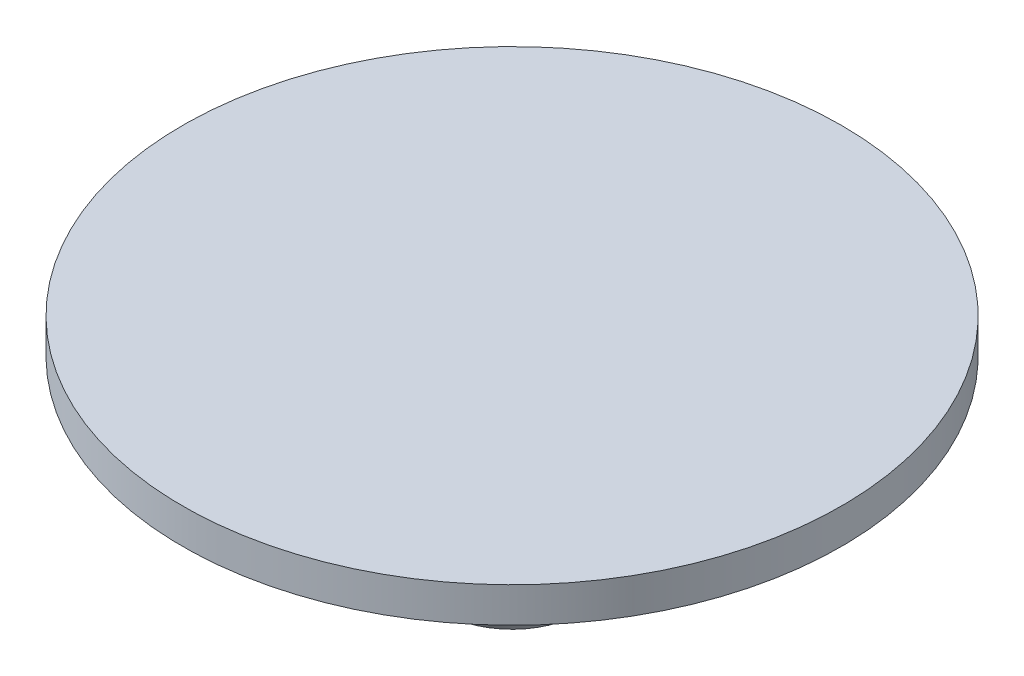
ISO-10303-21;
HEADER;
FILE_DESCRIPTION(('STEP AP214'),'2;1');
FILE_NAME('part.step','',(''),(''),'','','');
FILE_SCHEMA(('AUTOMOTIVE_DESIGN { 1 0 10303 214 1 1 1 1 }'));
ENDSEC;
DATA;
#1=APPLICATION_CONTEXT('core data for automotive mechanical design processes');
#2=APPLICATION_PROTOCOL_DEFINITION('international standard','automotive_design',2000,#1);
#3=PRODUCT_CONTEXT('',#1,'mechanical');
#4=PRODUCT('Part','Part','',(#3));
#5=PRODUCT_RELATED_PRODUCT_CATEGORY('part','',(#4));
#6=PRODUCT_DEFINITION_FORMATION('','',#4);
#7=PRODUCT_DEFINITION_CONTEXT('part definition',#1,'design');
#8=PRODUCT_DEFINITION('design','',#6,#7);
#9=PRODUCT_DEFINITION_SHAPE('','',#8);
#10=(LENGTH_UNIT() NAMED_UNIT(*) SI_UNIT(.MILLI.,.METRE.));
#11=(NAMED_UNIT(*) PLANE_ANGLE_UNIT() SI_UNIT($,.RADIAN.));
#12=(NAMED_UNIT(*) SI_UNIT($,.STERADIAN.) SOLID_ANGLE_UNIT());
#13=UNCERTAINTY_MEASURE_WITH_UNIT(LENGTH_MEASURE(1.E-05),#10,'distance_accuracy_value','');
#14=(GEOMETRIC_REPRESENTATION_CONTEXT(3) GLOBAL_UNCERTAINTY_ASSIGNED_CONTEXT((#13)) GLOBAL_UNIT_ASSIGNED_CONTEXT((#10,
#11,#12)) REPRESENTATION_CONTEXT('',''));
#15=CARTESIAN_POINT('',(0.,0.,0.));
#16=DIRECTION('',(0.,0.,1.));
#17=DIRECTION('',(1.,0.,0.));
#18=AXIS2_PLACEMENT_3D('',#15,#16,#17);
#19=CARTESIAN_POINT('',(0.,0.,0.));
#20=DIRECTION('',(0.,1.,0.));
#21=DIRECTION('',(0.,0.,1.));
#22=AXIS2_PLACEMENT_3D('',#19,#20,#21);
#23=PLANE('',#22);
#24=CARTESIAN_POINT('',(0.,0.,0.));
#25=DIRECTION('',(0.,-1.,0.));
#26=DIRECTION('',(0.,0.,-1.));
#27=AXIS2_PLACEMENT_3D('',#24,#25,#26);
#28=CIRCLE('',#27,14.1);
#29=CARTESIAN_POINT('',(0.,0.,-14.1));
#30=VERTEX_POINT('',#29);
#31=EDGE_CURVE('E10',#30,#30,#28,.T.);
#32=ORIENTED_EDGE('',*,*,#31,.F.);
#33=EDGE_LOOP('',(#32));
#34=FACE_BOUND('',#33,.T.);
#35=ADVANCED_FACE('F32',(#34),#23,.T.);
#36=CARTESIAN_POINT('',(0.,-1.5,0.));
#37=DIRECTION('',(0.,-1.,0.));
#38=DIRECTION('',(0.,0.,-1.));
#39=AXIS2_PLACEMENT_3D('',#36,#37,#38);
#40=CYLINDRICAL_SURFACE('',#39,14.1);
#41=ORIENTED_EDGE('',*,*,#31,.T.);
#42=EDGE_LOOP('',(#41));
#43=FACE_BOUND('',#42,.T.);
#44=CARTESIAN_POINT('',(0.,-1.5,0.));
#45=DIRECTION('',(0.,-1.,0.));
#46=DIRECTION('',(0.,0.,-1.));
#47=AXIS2_PLACEMENT_3D('',#44,#45,#46);
#48=CIRCLE('',#47,14.1);
#49=CARTESIAN_POINT('',(0.,-1.5,-14.1));
#50=VERTEX_POINT('',#49);
#51=EDGE_CURVE('E44',#50,#50,#48,.T.);
#52=ORIENTED_EDGE('',*,*,#51,.F.);
#53=EDGE_LOOP('',(#52));
#54=FACE_BOUND('',#53,.T.);
#55=ADVANCED_FACE('F95',(#43,#54),#40,.T.);
#56=CARTESIAN_POINT('',(14.1,-1.5,0.));
#57=DIRECTION('',(0.,-1.,0.));
#58=DIRECTION('',(0.,0.,-1.));
#59=AXIS2_PLACEMENT_3D('',#56,#57,#58);
#60=PLANE('',#59);
#61=ORIENTED_EDGE('',*,*,#51,.T.);
#62=EDGE_LOOP('',(#61));
#63=FACE_BOUND('',#62,.T.);
#64=CARTESIAN_POINT('',(0.,-1.5,0.));
#65=DIRECTION('',(0.,-1.,0.));
#66=DIRECTION('',(0.,0.,-1.));
#67=AXIS2_PLACEMENT_3D('',#64,#65,#66);
#68=CIRCLE('',#67,6.85);
#69=CARTESIAN_POINT('',(0.,-1.5,-6.85));
#70=VERTEX_POINT('',#69);
#71=EDGE_CURVE('E48',#70,#70,#68,.T.);
#72=ORIENTED_EDGE('',*,*,#71,.F.);
#73=EDGE_LOOP('',(#72));
#74=FACE_BOUND('',#73,.T.);
#75=ADVANCED_FACE('F91',(#63,#74),#60,.T.);
#76=CARTESIAN_POINT('',(0.,-9.5,0.));
#77=DIRECTION('',(0.,1.,0.));
#78=DIRECTION('',(0.,0.,1.));
#79=AXIS2_PLACEMENT_3D('',#76,#77,#78);
#80=CONICAL_SURFACE('',#79,3.,0.448535409414174);
#81=CARTESIAN_POINT('',(-0.633272972255013,-4.52228697401176,-5.35823186437053));
#82=CARTESIAN_POINT('',(-0.582962055692206,-4.49272093928371,-5.37850607182665));
#83=CARTESIAN_POINT('',(-0.529990890777475,-4.4663413441588,-5.39678092828851));
#84=CARTESIAN_POINT('',(-0.419568643337227,-4.42101153491379,-5.42836359473395));
#85=CARTESIAN_POINT('',(-0.362121337565608,-4.40205513712441,-5.44167553847619));
#86=CARTESIAN_POINT('',(-0.243768429368954,-4.3724763172608,-5.46251107954339));
#87=CARTESIAN_POINT('',(-0.18284697818391,-4.36189601964438,-5.47000541576709));
#88=CARTESIAN_POINT('',(-0.0596564082112393,-4.34989335628605,-5.47851062070043));
#89=CARTESIAN_POINT('',(0.00261238422585923,-4.34846879723026,-5.47952304219267));
#90=CARTESIAN_POINT('',(0.122528147838459,-4.35466228519997,-5.47513102623614));
#91=CARTESIAN_POINT('',(0.180220297473829,-4.36171948178841,-5.47012457629421));
#92=CARTESIAN_POINT('',(0.293365693468892,-4.38354706839695,-5.45470585520708));
#93=CARTESIAN_POINT('',(0.348818667041851,-4.39831839515207,-5.44429292754844));
#94=CARTESIAN_POINT('',(0.457103744456638,-4.4351461457224,-5.41849719708117));
#95=CARTESIAN_POINT('',(0.509875094985693,-4.45732240695604,-5.40303273901462));
#96=CARTESIAN_POINT('',(0.610837214912478,-4.50795078170534,-5.36803231896509));
#97=CARTESIAN_POINT('',(0.659026298046859,-4.5364051928733,-5.3484948665086));
#98=CARTESIAN_POINT('',(0.756261611645401,-4.60276655659272,-5.30341941110671));
#99=CARTESIAN_POINT('',(0.804583605372491,-4.64142508293112,-5.27742991787235));
#100=CARTESIAN_POINT('',(0.89416797875589,-4.72438761426675,-5.22249235860638));
#101=CARTESIAN_POINT('',(0.935426096925696,-4.76869499918064,-5.19354252336458));
#102=CARTESIAN_POINT('',(1.01726098527355,-4.87017588870365,-5.12842464391135));
#103=CARTESIAN_POINT('',(1.0564374839851,-4.92824094328228,-5.09188340347651));
#104=CARTESIAN_POINT('',(1.12438273064406,-5.04945663946227,-5.01754963505027));
#105=CARTESIAN_POINT('',(1.15314397639543,-5.11261090699562,-4.97975622641435));
#106=CARTESIAN_POINT('',(1.20293967786085,-5.25135627713908,-4.89926539707666));
#107=CARTESIAN_POINT('',(1.22247417309756,-5.32749437401264,-4.85657222151437));
#108=CARTESIAN_POINT('',(1.24700956332617,-5.48308287996698,-4.77298156918373));
#109=CARTESIAN_POINT('',(1.25200652285652,-5.56253418006292,-4.73208458161259));
#110=CARTESIAN_POINT('',(1.24653941806823,-5.72271943434377,-4.653768121928));
#111=CARTESIAN_POINT('',(1.23606932120088,-5.80345387683626,-4.61635001271746));
#112=CARTESIAN_POINT('',(1.19882761930746,-5.96335908775868,-4.54662401054345));
#113=CARTESIAN_POINT('',(1.17207343468682,-6.04253143397295,-4.51431070302596));
#114=CARTESIAN_POINT('',(1.10608956779471,-6.18706269625163,-4.45927966951933));
#115=CARTESIAN_POINT('',(1.06862198356642,-6.25296918752537,-4.43588893360888));
#116=CARTESIAN_POINT('',(0.981374987852063,-6.37794395911093,-4.39439805536346));
#117=CARTESIAN_POINT('',(0.931603757932647,-6.4370167454726,-4.37629441464452));
#118=CARTESIAN_POINT('',(0.826966453509696,-6.53991707801657,-4.34681022023684));
#119=CARTESIAN_POINT('',(0.773167785729984,-6.58469104785266,-4.33492642440838));
#120=CARTESIAN_POINT('',(0.658381129818306,-6.66486200186304,-4.31481437924573));
#121=CARTESIAN_POINT('',(0.597394333814064,-6.7002605377694,-4.30658552482778));
#122=CARTESIAN_POINT('',(0.472004188387053,-6.75947200632147,-4.29343448064075));
#123=CARTESIAN_POINT('',(0.40776079441884,-6.78360407062297,-4.28841947917799));
#124=CARTESIAN_POINT('',(0.276058545860753,-6.82105621928804,-4.28084698650507));
#125=CARTESIAN_POINT('',(0.208599716360258,-6.83437638799999,-4.2782894761229));
#126=CARTESIAN_POINT('',(0.0720940392704948,-6.84981585361144,-4.2753386616857));
#127=CARTESIAN_POINT('',(0.00304193657907059,-6.85189032383684,-4.27495401867934));
#128=CARTESIAN_POINT('',(-0.134444039661222,-6.84465398526422,-4.276324505544));
#129=CARTESIAN_POINT('',(-0.202877893707582,-6.8353428185635,-4.27807970267999));
#130=CARTESIAN_POINT('',(-0.337386850640317,-6.80558201500571,-4.28394677750608));
#131=CARTESIAN_POINT('',(-0.403454498884584,-6.78509999913953,-4.28806550778029));
#132=CARTESIAN_POINT('',(-0.53111862978522,-6.7336438563374,-4.29908208430313));
#133=CARTESIAN_POINT('',(-0.592715443922478,-6.7026705082268,-4.30597972426625));
#134=CARTESIAN_POINT('',(-0.7094038382995,-6.63145354549162,-4.32303105994163));
#135=CARTESIAN_POINT('',(-0.764523815875468,-6.59125287029697,-4.3331697566333));
#136=CARTESIAN_POINT('',(-0.867057524664055,-6.50293358552318,-4.35716749814495));
#137=CARTESIAN_POINT('',(-0.914472143009496,-6.4548158887315,-4.37102611419559));
#138=CARTESIAN_POINT('',(-1.00040316532292,-6.35243410903065,-4.40270394020078));
#139=CARTESIAN_POINT('',(-1.03892729108261,-6.29817542137013,-4.42051968661147));
#140=CARTESIAN_POINT('',(-1.10643568614045,-6.1853422832638,-4.46007472684007));
#141=CARTESIAN_POINT('',(-1.13541850305561,-6.12676717742984,-4.48181461721413));
#142=CARTESIAN_POINT('',(-1.18453088449555,-6.00481269523303,-4.52977850338575));
#143=CARTESIAN_POINT('',(-1.20427795132247,-5.94133521304163,-4.55614258020141));
#144=CARTESIAN_POINT('',(-1.23339006945145,-5.81343917855876,-4.61208960740105));
#145=CARTESIAN_POINT('',(-1.24275094677872,-5.74902025845387,-4.64167384665468));
#146=CARTESIAN_POINT('',(-1.25191535159751,-5.61432188361672,-4.70632087074806));
#147=CARTESIAN_POINT('',(-1.2506806782118,-5.54409377336257,-4.7416360672416));
#148=CARTESIAN_POINT('',(-1.23677045533377,-5.4057325595818,-4.81406106105282));
#149=CARTESIAN_POINT('',(-1.2240894874623,-5.33760046405091,-4.85117170041196));
#150=CARTESIAN_POINT('',(-1.18573215147421,-5.19694995765824,-4.93035156065004));
#151=CARTESIAN_POINT('',(-1.1587223610357,-5.1248356566689,-4.97249784947305));
#152=CARTESIAN_POINT('',(-1.0916695234403,-4.986249114745,-5.05589748642324));
#153=CARTESIAN_POINT('',(-1.05161251034163,-4.9197830162877,-5.09714982696444));
#154=CARTESIAN_POINT('',(-0.956617590956275,-4.79124871222183,-5.1787703611877));
#155=CARTESIAN_POINT('',(-0.901051085727982,-4.72955123505996,-5.21899814868899));
#156=CARTESIAN_POINT('',(-0.7766769183392,-4.61701171447418,-5.29368516333928));
#157=CARTESIAN_POINT('',(-0.707901652317313,-4.5661437410352,-5.32815812600261));
#158=CARTESIAN_POINT('',(-0.633272972255013,-4.52228697401176,-5.35823186437053));
#159=B_SPLINE_CURVE_WITH_KNOTS('',3,(#81,#82,#83,#84,#85,#86,#87,#88,#89,#90,#91,#92,#93,#94,
#95,#96,#97,#98,#99,#100,#101,#102,#103,#104,#105,#106,#107,#108,#109,#110,#111,#112,#113,#114,
#115,#116,#117,#118,#119,#120,#121,#122,#123,#124,#125,#126,#127,#128,#129,#130,#131,#132,#133,
#134,#135,#136,#137,#138,#139,#140,#141,#142,#143,#144,#145,#146,#147,#148,#149,#150,#151,#152,
#153,#154,#155,#156,#157,#158),.UNSPECIFIED.,.T.,.F.,(4,2,2,2,2,2,2,2,2,2,2,2,2,2,2,2,2,2,2,2,2,
2,2,2,2,2,2,2,2,2,2,2,2,2,2,2,2,2,4),(0.,0.185100254813369,0.370045987790329,0.555916029987707,
0.741741544205221,0.915926712712724,1.09013303762993,1.26730754010537,1.44454699207137,
1.64514816923708,1.84586994165695,2.08194966146773,2.31819909485878,2.58530703768191,
2.85248728266774,3.11977176231852,3.38677080748728,3.62344423209498,3.85996069712196,
4.07189143638563,4.28378707695089,4.48924910284956,4.69470952583281,4.90098833923221,
5.10727363708584,5.31416006094039,5.52103112992022,5.72695836945884,5.93286188337595,
6.13858588207995,6.34434118173401,6.55799369435035,6.77173203801726,7.00663567148817,
7.24165056060052,7.50384751993755,7.7663260662643,8.04156108416425,8.3161294808396),.UNSPECIFIED.);
#160=CARTESIAN_POINT('',(-0.633272972255013,-4.52228697401176,-5.35823186437053));
#161=VERTEX_POINT('',#160);
#162=EDGE_CURVE('E62',#161,#161,#159,.T.);
#163=ORIENTED_EDGE('',*,*,#162,.F.);
#164=EDGE_LOOP('',(#163));
#165=FACE_BOUND('',#164,.T.);
#166=ORIENTED_EDGE('',*,*,#71,.T.);
#167=EDGE_LOOP('',(#166));
#168=FACE_BOUND('',#167,.T.);
#169=CARTESIAN_POINT('',(0.,-9.5,0.));
#170=DIRECTION('',(0.,-1.,0.));
#171=DIRECTION('',(0.,0.,-1.));
#172=AXIS2_PLACEMENT_3D('',#169,#170,#171);
#173=CIRCLE('',#172,3.);
#174=CARTESIAN_POINT('',(0.,-9.5,-3.));
#175=VERTEX_POINT('',#174);
#176=EDGE_CURVE('E53',#175,#175,#173,.T.);
#177=ORIENTED_EDGE('',*,*,#176,.F.);
#178=EDGE_LOOP('',(#177));
#179=FACE_BOUND('',#178,.T.);
#180=ADVANCED_FACE('F68',(#165,#168,#179),#80,.T.);
#181=CARTESIAN_POINT('',(3.,-9.5,0.));
#182=DIRECTION('',(0.,-1.,0.));
#183=DIRECTION('',(0.,0.,-1.));
#184=AXIS2_PLACEMENT_3D('',#181,#182,#183);
#185=PLANE('',#184);
#186=ORIENTED_EDGE('',*,*,#176,.T.);
#187=EDGE_LOOP('',(#186));
#188=FACE_BOUND('',#187,.T.);
#189=CARTESIAN_POINT('',(0.,-9.5,0.));
#190=DIRECTION('',(0.,-1.,0.));
#191=DIRECTION('',(0.,0.,-1.));
#192=AXIS2_PLACEMENT_3D('',#189,#190,#191);
#193=CIRCLE('',#192,2.);
#194=CARTESIAN_POINT('',(0.,-9.5,-2.));
#195=VERTEX_POINT('',#194);
#196=EDGE_CURVE('E56',#195,#195,#193,.T.);
#197=ORIENTED_EDGE('',*,*,#196,.F.);
#198=EDGE_LOOP('',(#197));
#199=FACE_BOUND('',#198,.T.);
#200=ADVANCED_FACE('F84',(#188,#199),#185,.T.);
#201=CARTESIAN_POINT('',(0.,-1.5,0.));
#202=DIRECTION('',(0.,-1.,0.));
#203=DIRECTION('',(0.,0.,-1.));
#204=AXIS2_PLACEMENT_3D('',#201,#202,#203);
#205=CYLINDRICAL_SURFACE('',#204,2.);
#206=CARTESIAN_POINT('',(0.,-4.35,-2.));
#207=CARTESIAN_POINT('',(-0.0635104730002026,-4.35000434999878,-1.99999595305313));
#208=CARTESIAN_POINT('',(-0.127096441053758,-4.35487301181781,-1.99694323311001));
#209=CARTESIAN_POINT('',(-0.252318262265282,-4.3740858034295,-1.98502167724102));
#210=CARTESIAN_POINT('',(-0.313950163299073,-4.38844799392548,-1.97614175574896));
#211=CARTESIAN_POINT('',(-0.433205558136783,-4.42581136316205,-1.95345852982134));
#212=CARTESIAN_POINT('',(-0.490847243665017,-4.44876978784088,-1.93967960778663));
#213=CARTESIAN_POINT('',(-0.60126036886836,-4.50238585079675,-1.90834598486073));
#214=CARTESIAN_POINT('',(-0.654032347276152,-4.53304263600919,-1.89079170235271));
#215=CARTESIAN_POINT('',(-0.757974192167973,-4.60388657318497,-1.85170152902273));
#216=CARTESIAN_POINT('',(-0.808679560769977,-4.64463929997545,-1.82995962224617));
#217=CARTESIAN_POINT('',(-0.90298637514676,-4.73321917450655,-1.78531349913632));
#218=CARTESIAN_POINT('',(-0.946578107215734,-4.78105582825794,-1.76240774858553));
#219=CARTESIAN_POINT('',(-1.03142873237132,-4.89003389420452,-1.71430418655199));
#220=CARTESIAN_POINT('',(-1.07157206029151,-4.95209978660728,-1.68921610993412));
#221=CARTESIAN_POINT('',(-1.14073966020039,-5.08356481544719,-1.64330198128731));
#222=CARTESIAN_POINT('',(-1.16978270899534,-5.15295131257608,-1.62246875996238));
#223=CARTESIAN_POINT('',(-1.20933400585981,-5.27881052377872,-1.59309575627364));
#224=CARTESIAN_POINT('',(-1.22269552371394,-5.33396681853882,-1.58276905990074));
#225=CARTESIAN_POINT('',(-1.2418184358548,-5.4463059256108,-1.56781357325805));
#226=CARTESIAN_POINT('',(-1.24759056342088,-5.50348575827449,-1.56317673673692));
#227=CARTESIAN_POINT('',(-1.2511891824572,-5.61841301675112,-1.56029885782827));
#228=CARTESIAN_POINT('',(-1.24899483727851,-5.6761615364624,-1.56207458771719));
#229=CARTESIAN_POINT('',(-1.23676317046804,-5.79031010318896,-1.5717740238392));
#230=CARTESIAN_POINT('',(-1.22671956265044,-5.84670903203908,-1.5797026576711));
#231=CARTESIAN_POINT('',(-1.19968103371474,-5.95543845265748,-1.60032573121781));
#232=CARTESIAN_POINT('',(-1.18285016736897,-6.00783245568427,-1.61290715104814));
#233=CARTESIAN_POINT('',(-1.14290189820938,-6.10916118240542,-1.64145566443406));
#234=CARTESIAN_POINT('',(-1.11978227193696,-6.15809467487449,-1.65742395501353));
#235=CARTESIAN_POINT('',(-1.06294892954949,-6.26083327383274,-1.6945481599302));
#236=CARTESIAN_POINT('',(-1.0280629660117,-6.31384081012039,-1.71611591575959));
#237=CARTESIAN_POINT('',(-0.950881463002103,-6.41383027900048,-1.76005711791243));
#238=CARTESIAN_POINT('',(-0.908578308011438,-6.46080593170652,-1.78243137335975));
#239=CARTESIAN_POINT('',(-0.809519713023333,-6.55530174937039,-1.82979894916857));
#240=CARTESIAN_POINT('',(-0.751531353595334,-6.60163297425883,-1.85461531676593));
#241=CARTESIAN_POINT('',(-0.627148099593571,-6.68385089588725,-1.90028055062445));
#242=CARTESIAN_POINT('',(-0.560756523882,-6.71974169772893,-1.92113097514764));
#243=CARTESIAN_POINT('',(-0.42488356293475,-6.77776368838142,-1.95553372961316));
#244=CARTESIAN_POINT('',(-0.355763457732372,-6.80053403998118,-1.96941976591574));
#245=CARTESIAN_POINT('',(-0.213612154574977,-6.83376492798281,-1.98984929310048));
#246=CARTESIAN_POINT('',(-0.140586648341306,-6.844242894222,-1.9964031799007));
#247=CARTESIAN_POINT('',(-0.00451561874058984,-6.8515658500612,-2.00097840540091));
#248=CARTESIAN_POINT('',(0.0584027741637836,-6.85020317795385,-2.00012161345511));
#249=CARTESIAN_POINT('',(0.182972117996308,-6.83811717157928,-1.99258901494327));
#250=CARTESIAN_POINT('',(0.244623154962732,-6.82739447490784,-1.98591360473591));
#251=CARTESIAN_POINT('',(0.362521070658188,-6.79776146330804,-1.9677405228307));
#252=CARTESIAN_POINT('',(0.418885009953203,-6.77918784320335,-1.95644170526844));
#253=CARTESIAN_POINT('',(0.527638281070987,-6.73470361072143,-1.92995684104751));
#254=CARTESIAN_POINT('',(0.580026945470714,-6.70879176974485,-1.91477014350266));
#255=CARTESIAN_POINT('',(0.685084056277256,-6.64748479400452,-1.87990012356));
#256=CARTESIAN_POINT('',(0.737246967843403,-6.61139643076176,-1.85991764817225));
#257=CARTESIAN_POINT('',(0.83514264021734,-6.53220613484719,-1.81806970001717));
#258=CARTESIAN_POINT('',(0.880868151291853,-6.48909641074546,-1.79620214826384));
#259=CARTESIAN_POINT('',(0.971474198022883,-6.38986496058735,-1.74905869713091));
#260=CARTESIAN_POINT('',(1.01526851939752,-6.33276279370522,-1.72374883414957));
#261=CARTESIAN_POINT('',(1.09280351885684,-6.21112421505575,-1.67566762748172));
#262=CARTESIAN_POINT('',(1.12655115718693,-6.14659299324701,-1.65289453322336));
#263=CARTESIAN_POINT('',(1.17684772011828,-6.02530785194313,-1.61733530314592));
#264=CARTESIAN_POINT('',(1.19551895865479,-5.96975924926778,-1.6034563619378));
#265=CARTESIAN_POINT('',(1.22500108205245,-5.85560685423108,-1.58105030663767));
#266=CARTESIAN_POINT('',(1.23582424983127,-5.79700799054854,-1.57251483242605));
#267=CARTESIAN_POINT('',(1.24901383653654,-5.67790972311931,-1.56206324988732));
#268=CARTESIAN_POINT('',(1.25133186963292,-5.61740141451183,-1.56018501674569));
#269=CARTESIAN_POINT('',(1.24719778716818,-5.49686903963396,-1.56349063109847));
#270=CARTESIAN_POINT('',(1.24074275650143,-5.43684514099049,-1.56867682595586));
#271=CARTESIAN_POINT('',(1.22038272403399,-5.32397020494864,-1.58455388771334));
#272=CARTESIAN_POINT('',(1.2071191949977,-5.27093069858359,-1.5947680805106));
#273=CARTESIAN_POINT('',(1.17417623469513,-5.16786494041409,-1.6191753043569));
#274=CARTESIAN_POINT('',(1.15449412799407,-5.1178399554625,-1.63336999423727));
#275=CARTESIAN_POINT('',(1.10602690439618,-5.0144032561273,-1.66663902886518));
#276=CARTESIAN_POINT('',(1.0763364445546,-4.96154970152345,-1.68612230498997));
#277=CARTESIAN_POINT('',(1.0100001703639,-4.861061632754,-1.72667706411868));
#278=CARTESIAN_POINT('',(0.973348732866944,-4.81343138743952,-1.74774982276825));
#279=CARTESIAN_POINT('',(0.885670221416064,-4.71498574502216,-1.79401910731181));
#280=CARTESIAN_POINT('',(0.833233674246798,-4.66540915455452,-1.81920541808776));
#281=CARTESIAN_POINT('',(0.719822446025208,-4.57550517029476,-1.86698729056748));
#282=CARTESIAN_POINT('',(0.658842515138554,-4.5351835040726,-1.88958124364395));
#283=CARTESIAN_POINT('',(0.529355399891412,-4.4652288698759,-1.92986710976548));
#284=CARTESIAN_POINT('',(0.460835727056574,-4.43561399459416,-1.94755071355356));
#285=CARTESIAN_POINT('',(0.318394712729503,-4.38892811566825,-1.97581521637842));
#286=CARTESIAN_POINT('',(0.244493501106853,-4.37181276513022,-1.98642121428689));
#287=CARTESIAN_POINT('',(0.141418481224667,-4.35770079083737,-1.99519472168143));
#288=CARTESIAN_POINT('',(0.113248608862872,-4.35481813466603,-1.99699172226301));
#289=CARTESIAN_POINT('',(0.0567241864870909,-4.3509667084624,-1.9993953021324));
#290=CARTESIAN_POINT('',(0.0283696251514533,-4.34999805689001,-2.00000180773911));
#291=CARTESIAN_POINT('',(0.,-4.35,-2.));
#292=B_SPLINE_CURVE_WITH_KNOTS('',3,(#206,#207,#208,#209,#210,#211,#212,#213,#214,#215,#216,
#217,#218,#219,#220,#221,#222,#223,#224,#225,#226,#227,#228,#229,#230,#231,#232,#233,#234,#235,
#236,#237,#238,#239,#240,#241,#242,#243,#244,#245,#246,#247,#248,#249,#250,#251,#252,#253,#254,
#255,#256,#257,#258,#259,#260,#261,#262,#263,#264,#265,#266,#267,#268,#269,#270,#271,#272,#273,
#274,#275,#276,#277,#278,#279,#280,#281,#282,#283,#284,#285,#286,#287,#288,#289,#290,#291),
.UNSPECIFIED.,.T.,.F.,(4,2,2,2,2,2,2,2,2,2,2,2,2,2,2,2,2,2,2,2,2,2,2,2,2,2,2,2,2,2,2,2,2,2,2,2,
2,2,2,2,2,2,4),(0.,0.190412301434133,0.381187894128462,0.571026987595136,0.760845054038796,
0.965821870536219,1.17107628325702,1.40412975852973,1.63678724607011,1.80912008879717,
1.98120894707391,2.15374823498778,2.32642584505083,2.49515839460437,2.66395067908033,
2.8642745035436,3.06480522575182,3.29842180699522,3.53194640727861,3.75284174135959,
3.97342347958131,4.16127180597573,4.34910733732281,4.52959504531298,4.71011298928466,
4.90885230990553,5.10781368827686,5.33565708863713,5.5633422719691,5.7432994031372,
5.92297427413352,6.10366974688201,6.28442527563864,6.45063169037741,6.61690747313442,
6.80725523036979,6.99775741153769,7.22600539035112,7.454394245785,7.68316725607078,
7.91112460944408,7.99617501232481,8.08123067890588),.UNSPECIFIED.);
#293=CARTESIAN_POINT('',(0.,-4.35,-2.));
#294=VERTEX_POINT('',#293);
#295=EDGE_CURVE('E35',#294,#294,#292,.T.);
#296=ORIENTED_EDGE('',*,*,#295,.F.);
#297=EDGE_LOOP('',(#296));
#298=FACE_BOUND('',#297,.T.);
#299=ORIENTED_EDGE('',*,*,#196,.T.);
#300=EDGE_LOOP('',(#299));
#301=FACE_BOUND('',#300,.T.);
#302=CARTESIAN_POINT('',(0.,-1.5,0.));
#303=DIRECTION('',(0.,-1.,0.));
#304=DIRECTION('',(0.,0.,-1.));
#305=AXIS2_PLACEMENT_3D('',#302,#303,#304);
#306=CIRCLE('',#305,2.);
#307=CARTESIAN_POINT('',(0.,-1.5,-2.));
#308=VERTEX_POINT('',#307);
#309=EDGE_CURVE('E59',#308,#308,#306,.T.);
#310=ORIENTED_EDGE('',*,*,#309,.F.);
#311=EDGE_LOOP('',(#310));
#312=FACE_BOUND('',#311,.T.);
#313=ADVANCED_FACE('F80',(#298,#301,#312),#205,.F.);
#314=CARTESIAN_POINT('',(2.,-1.5,0.));
#315=DIRECTION('',(0.,-1.,0.));
#316=DIRECTION('',(0.,0.,-1.));
#317=AXIS2_PLACEMENT_3D('',#314,#315,#316);
#318=PLANE('',#317);
#319=ORIENTED_EDGE('',*,*,#309,.T.);
#320=EDGE_LOOP('',(#319));
#321=FACE_BOUND('',#320,.T.);
#322=ADVANCED_FACE('F76',(#321),#318,.T.);
#323=CARTESIAN_POINT('',(0.,-5.6,-10.));
#324=DIRECTION('',(0.,0.,1.));
#325=DIRECTION('',(1.,0.,0.));
#326=AXIS2_PLACEMENT_3D('',#323,#324,#325);
#327=CYLINDRICAL_SURFACE('',#326,1.25);
#328=ORIENTED_EDGE('',*,*,#162,.T.);
#329=EDGE_LOOP('',(#328));
#330=FACE_BOUND('',#329,.T.);
#331=ORIENTED_EDGE('',*,*,#295,.T.);
#332=EDGE_LOOP('',(#331));
#333=FACE_BOUND('',#332,.T.);
#334=ADVANCED_FACE('F72',(#330,#333),#327,.F.);
#335=CLOSED_SHELL('',(#35,#55,#75,#180,#200,#313,#322,#334));
#336=MANIFOLD_SOLID_BREP('B2',#335);
#337=ADVANCED_BREP_SHAPE_REPRESENTATION('',(#18,#336),#14);
#338=SHAPE_DEFINITION_REPRESENTATION(#9,#337);
ENDSEC;
END-ISO-10303-21;
